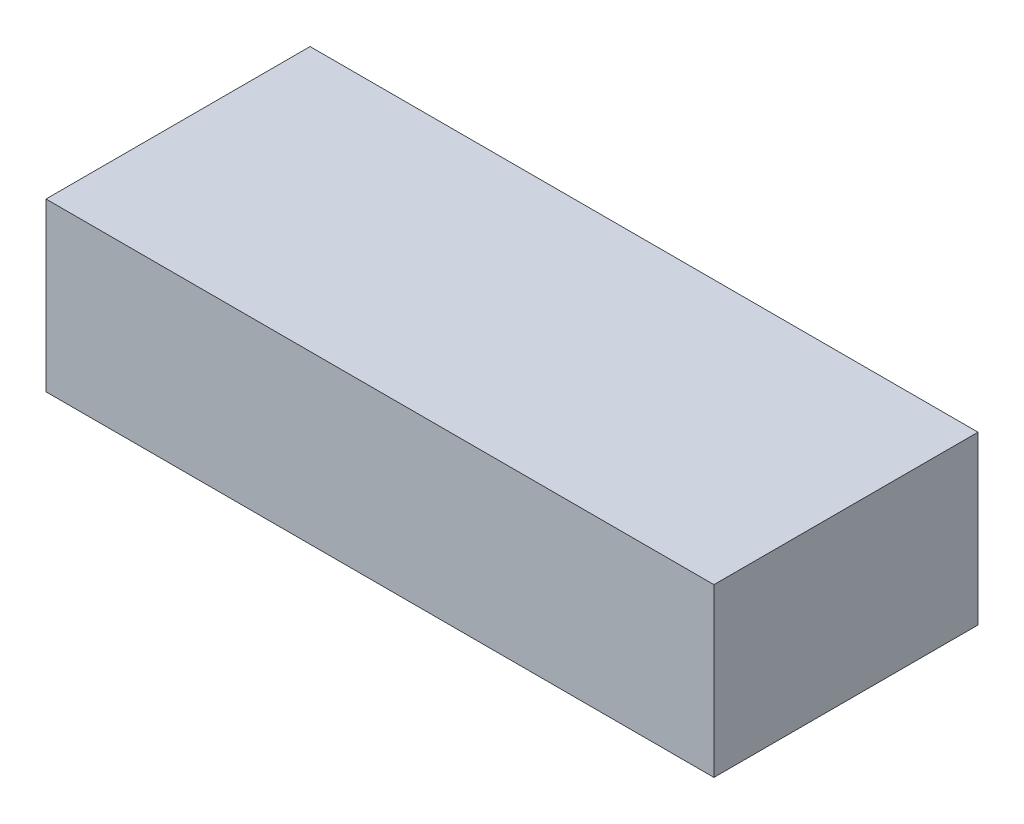
ISO-10303-21;
HEADER;
FILE_DESCRIPTION(('STEP AP214'),'2;1');
FILE_NAME('part.step','',(''),(''),'','','');
FILE_SCHEMA(('AUTOMOTIVE_DESIGN { 1 0 10303 214 1 1 1 1 }'));
ENDSEC;
DATA;
#1=APPLICATION_CONTEXT('core data for automotive mechanical design processes');
#2=APPLICATION_PROTOCOL_DEFINITION('international standard','automotive_design',2000,#1);
#3=PRODUCT_CONTEXT('',#1,'mechanical');
#4=PRODUCT('Part','Part','',(#3));
#5=PRODUCT_RELATED_PRODUCT_CATEGORY('part','',(#4));
#6=PRODUCT_DEFINITION_FORMATION('','',#4);
#7=PRODUCT_DEFINITION_CONTEXT('part definition',#1,'design');
#8=PRODUCT_DEFINITION('design','',#6,#7);
#9=PRODUCT_DEFINITION_SHAPE('','',#8);
#10=(LENGTH_UNIT() NAMED_UNIT(*) SI_UNIT(.MILLI.,.METRE.));
#11=(NAMED_UNIT(*) PLANE_ANGLE_UNIT() SI_UNIT($,.RADIAN.));
#12=(NAMED_UNIT(*) SI_UNIT($,.STERADIAN.) SOLID_ANGLE_UNIT());
#13=UNCERTAINTY_MEASURE_WITH_UNIT(LENGTH_MEASURE(1.E-05),#10,'distance_accuracy_value','');
#14=(GEOMETRIC_REPRESENTATION_CONTEXT(3) GLOBAL_UNCERTAINTY_ASSIGNED_CONTEXT((#13)) GLOBAL_UNIT_ASSIGNED_CONTEXT((#10,
#11,#12)) REPRESENTATION_CONTEXT('',''));
#15=CARTESIAN_POINT('',(0.,0.,0.));
#16=DIRECTION('',(0.,0.,1.));
#17=DIRECTION('',(1.,0.,0.));
#18=AXIS2_PLACEMENT_3D('',#15,#16,#17);
#19=CARTESIAN_POINT('',(86.,21.5,-34.));
#20=DIRECTION('',(-1.,0.,0.));
#21=DIRECTION('',(0.,0.,1.));
#22=AXIS2_PLACEMENT_3D('',#19,#20,#21);
#23=PLANE('',#22);
#24=DIRECTION('',(0.,0.,-1.));
#25=VECTOR('',#24,1.);
#26=CARTESIAN_POINT('',(86.,-21.5,-34.));
#27=LINE('',#26,#25);
#28=CARTESIAN_POINT('',(86.,-21.5,34.));
#29=VERTEX_POINT('',#28);
#30=CARTESIAN_POINT('',(86.,-21.5,-34.));
#31=VERTEX_POINT('',#30);
#32=EDGE_CURVE('E101',#29,#31,#27,.T.);
#33=ORIENTED_EDGE('',*,*,#32,.T.);
#34=DIRECTION('',(0.,-1.,0.));
#35=VECTOR('',#34,1.);
#36=CARTESIAN_POINT('',(86.,21.5,-34.));
#37=LINE('',#36,#35);
#38=CARTESIAN_POINT('',(86.,21.5,-34.));
#39=VERTEX_POINT('',#38);
#40=EDGE_CURVE('E11',#39,#31,#37,.T.);
#41=ORIENTED_EDGE('',*,*,#40,.F.);
#42=DIRECTION('',(0.,0.,-1.));
#43=VECTOR('',#42,1.);
#44=CARTESIAN_POINT('',(86.,21.5,-34.));
#45=LINE('',#44,#43);
#46=CARTESIAN_POINT('',(86.,21.5,34.));
#47=VERTEX_POINT('',#46);
#48=EDGE_CURVE('E89',#47,#39,#45,.T.);
#49=ORIENTED_EDGE('',*,*,#48,.F.);
#50=DIRECTION('',(0.,-1.,0.));
#51=VECTOR('',#50,1.);
#52=CARTESIAN_POINT('',(86.,21.5,34.));
#53=LINE('',#52,#51);
#54=EDGE_CURVE('E97',#47,#29,#53,.T.);
#55=ORIENTED_EDGE('',*,*,#54,.T.);
#56=EDGE_LOOP('',(#33,#41,#49,#55));
#57=FACE_BOUND('',#56,.T.);
#58=ADVANCED_FACE('F38',(#57),#23,.F.);
#59=CARTESIAN_POINT('',(-86.,21.5,-34.));
#60=DIRECTION('',(0.,0.,1.));
#61=DIRECTION('',(1.,0.,0.));
#62=AXIS2_PLACEMENT_3D('',#59,#60,#61);
#63=PLANE('',#62);
#64=DIRECTION('',(-1.,0.,0.));
#65=VECTOR('',#64,1.);
#66=CARTESIAN_POINT('',(-86.,-21.5,-34.));
#67=LINE('',#66,#65);
#68=CARTESIAN_POINT('',(-86.,-21.5,-34.));
#69=VERTEX_POINT('',#68);
#70=EDGE_CURVE('E93',#31,#69,#67,.T.);
#71=ORIENTED_EDGE('',*,*,#70,.T.);
#72=DIRECTION('',(0.,-1.,0.));
#73=VECTOR('',#72,1.);
#74=CARTESIAN_POINT('',(-86.,21.5,-34.));
#75=LINE('',#74,#73);
#76=CARTESIAN_POINT('',(-86.,21.5,-34.));
#77=VERTEX_POINT('',#76);
#78=EDGE_CURVE('E46',#77,#69,#75,.T.);
#79=ORIENTED_EDGE('',*,*,#78,.F.);
#80=DIRECTION('',(-1.,0.,0.));
#81=VECTOR('',#80,1.);
#82=CARTESIAN_POINT('',(-86.,21.5,-34.));
#83=LINE('',#82,#81);
#84=EDGE_CURVE('E84',#39,#77,#83,.T.);
#85=ORIENTED_EDGE('',*,*,#84,.F.);
#86=ORIENTED_EDGE('',*,*,#40,.T.);
#87=EDGE_LOOP('',(#71,#79,#85,#86));
#88=FACE_BOUND('',#87,.T.);
#89=ADVANCED_FACE('F92',(#88),#63,.F.);
#90=CARTESIAN_POINT('',(-86.,21.5,-34.));
#91=DIRECTION('',(1.,0.,0.));
#92=DIRECTION('',(0.,0.,-1.));
#93=AXIS2_PLACEMENT_3D('',#90,#91,#92);
#94=PLANE('',#93);
#95=DIRECTION('',(0.,0.,1.));
#96=VECTOR('',#95,1.);
#97=CARTESIAN_POINT('',(-86.,-21.5,-34.));
#98=LINE('',#97,#96);
#99=CARTESIAN_POINT('',(-86.,-21.5,34.));
#100=VERTEX_POINT('',#99);
#101=EDGE_CURVE('E71',#69,#100,#98,.T.);
#102=ORIENTED_EDGE('',*,*,#101,.T.);
#103=DIRECTION('',(0.,-1.,0.));
#104=VECTOR('',#103,1.);
#105=CARTESIAN_POINT('',(-86.,21.5,34.));
#106=LINE('',#105,#104);
#107=CARTESIAN_POINT('',(-86.,21.5,34.));
#108=VERTEX_POINT('',#107);
#109=EDGE_CURVE('E94',#108,#100,#106,.T.);
#110=ORIENTED_EDGE('',*,*,#109,.F.);
#111=DIRECTION('',(0.,0.,1.));
#112=VECTOR('',#111,1.);
#113=CARTESIAN_POINT('',(-86.,21.5,-34.));
#114=LINE('',#113,#112);
#115=EDGE_CURVE('E87',#77,#108,#114,.T.);
#116=ORIENTED_EDGE('',*,*,#115,.F.);
#117=ORIENTED_EDGE('',*,*,#78,.T.);
#118=EDGE_LOOP('',(#102,#110,#116,#117));
#119=FACE_BOUND('',#118,.T.);
#120=ADVANCED_FACE('F95',(#119),#94,.F.);
#121=CARTESIAN_POINT('',(-86.,21.5,34.));
#122=DIRECTION('',(0.,0.,-1.));
#123=DIRECTION('',(-1.,0.,0.));
#124=AXIS2_PLACEMENT_3D('',#121,#122,#123);
#125=PLANE('',#124);
#126=DIRECTION('',(1.,0.,0.));
#127=VECTOR('',#126,1.);
#128=CARTESIAN_POINT('',(-86.,-21.5,34.));
#129=LINE('',#128,#127);
#130=EDGE_CURVE('E77',#100,#29,#129,.T.);
#131=ORIENTED_EDGE('',*,*,#130,.T.);
#132=ORIENTED_EDGE('',*,*,#54,.F.);
#133=DIRECTION('',(1.,0.,0.));
#134=VECTOR('',#133,1.);
#135=CARTESIAN_POINT('',(-86.,21.5,34.));
#136=LINE('',#135,#134);
#137=EDGE_CURVE('E54',#108,#47,#136,.T.);
#138=ORIENTED_EDGE('',*,*,#137,.F.);
#139=ORIENTED_EDGE('',*,*,#109,.T.);
#140=EDGE_LOOP('',(#131,#132,#138,#139));
#141=FACE_BOUND('',#140,.T.);
#142=ADVANCED_FACE('F108',(#141),#125,.F.);
#143=CARTESIAN_POINT('',(0.,21.5,0.));
#144=DIRECTION('',(0.,1.,0.));
#145=DIRECTION('',(0.,0.,1.));
#146=AXIS2_PLACEMENT_3D('',#143,#144,#145);
#147=PLANE('',#146);
#148=ORIENTED_EDGE('',*,*,#48,.T.);
#149=ORIENTED_EDGE('',*,*,#84,.T.);
#150=ORIENTED_EDGE('',*,*,#115,.T.);
#151=ORIENTED_EDGE('',*,*,#137,.T.);
#152=EDGE_LOOP('',(#148,#149,#150,#151));
#153=FACE_BOUND('',#152,.T.);
#154=ADVANCED_FACE('F85',(#153),#147,.T.);
#155=CARTESIAN_POINT('',(0.,-21.5,0.));
#156=DIRECTION('',(0.,1.,0.));
#157=DIRECTION('',(0.,0.,1.));
#158=AXIS2_PLACEMENT_3D('',#155,#156,#157);
#159=PLANE('',#158);
#160=ORIENTED_EDGE('',*,*,#32,.F.);
#161=ORIENTED_EDGE('',*,*,#130,.F.);
#162=ORIENTED_EDGE('',*,*,#101,.F.);
#163=ORIENTED_EDGE('',*,*,#70,.F.);
#164=EDGE_LOOP('',(#160,#161,#162,#163));
#165=FACE_BOUND('',#164,.T.);
#166=ADVANCED_FACE('F111',(#165),#159,.F.);
#167=CLOSED_SHELL('',(#58,#89,#120,#142,#154,#166));
#168=MANIFOLD_SOLID_BREP('B2',#167);
#169=ADVANCED_BREP_SHAPE_REPRESENTATION('',(#18,#168),#14);
#170=SHAPE_DEFINITION_REPRESENTATION(#9,#169);
ENDSEC;
END-ISO-10303-21;
